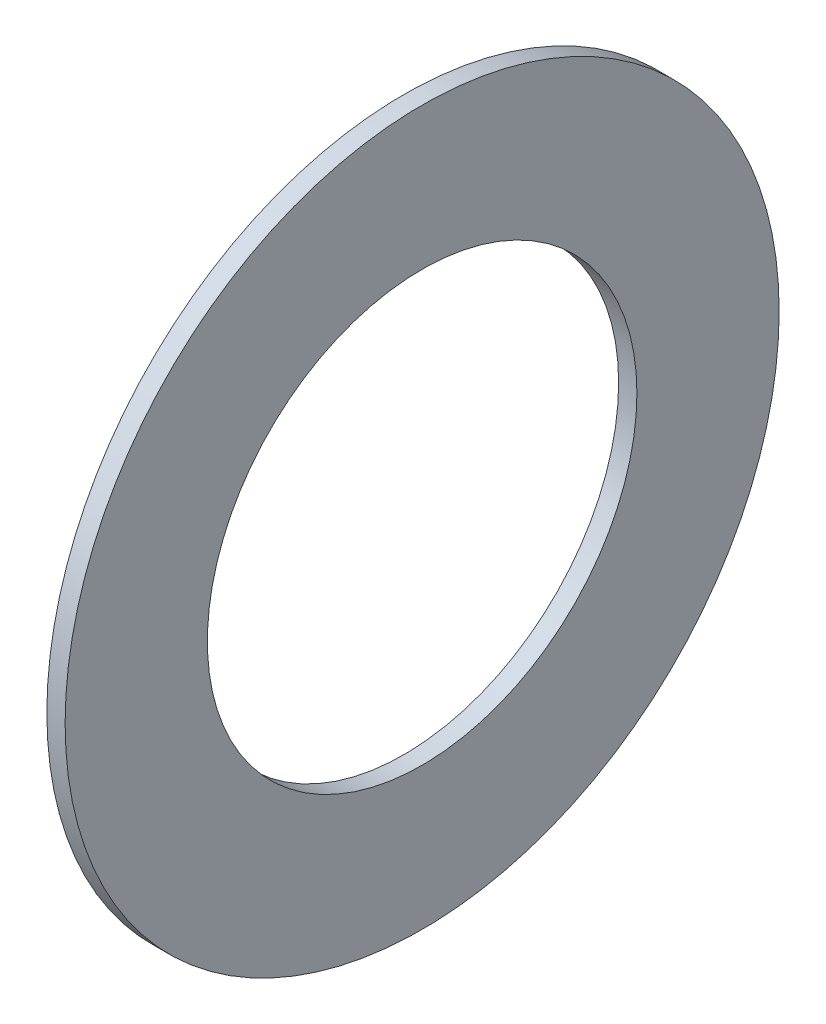
ISO-10303-21;
HEADER;
FILE_DESCRIPTION(('STEP AP214'),'2;1');
FILE_NAME('part.step','',(''),(''),'','','');
FILE_SCHEMA(('AUTOMOTIVE_DESIGN { 1 0 10303 214 1 1 1 1 }'));
ENDSEC;
DATA;
#1=APPLICATION_CONTEXT('core data for automotive mechanical design processes');
#2=APPLICATION_PROTOCOL_DEFINITION('international standard','automotive_design',2000,#1);
#3=PRODUCT_CONTEXT('',#1,'mechanical');
#4=PRODUCT('Part','Part','',(#3));
#5=PRODUCT_RELATED_PRODUCT_CATEGORY('part','',(#4));
#6=PRODUCT_DEFINITION_FORMATION('','',#4);
#7=PRODUCT_DEFINITION_CONTEXT('part definition',#1,'design');
#8=PRODUCT_DEFINITION('design','',#6,#7);
#9=PRODUCT_DEFINITION_SHAPE('','',#8);
#10=(LENGTH_UNIT() NAMED_UNIT(*) SI_UNIT(.MILLI.,.METRE.));
#11=(NAMED_UNIT(*) PLANE_ANGLE_UNIT() SI_UNIT($,.RADIAN.));
#12=(NAMED_UNIT(*) SI_UNIT($,.STERADIAN.) SOLID_ANGLE_UNIT());
#13=UNCERTAINTY_MEASURE_WITH_UNIT(LENGTH_MEASURE(1.E-05),#10,'distance_accuracy_value','');
#14=(GEOMETRIC_REPRESENTATION_CONTEXT(3) GLOBAL_UNCERTAINTY_ASSIGNED_CONTEXT((#13)) GLOBAL_UNIT_ASSIGNED_CONTEXT((#10,
#11,#12)) REPRESENTATION_CONTEXT('',''));
#15=CARTESIAN_POINT('',(0.,0.,0.));
#16=DIRECTION('',(0.,0.,1.));
#17=DIRECTION('',(1.,0.,0.));
#18=AXIS2_PLACEMENT_3D('',#15,#16,#17);
#19=CARTESIAN_POINT('',(0.8128,0.,0.));
#20=DIRECTION('',(1.,0.,0.));
#21=DIRECTION('',(0.,0.,-1.));
#22=AXIS2_PLACEMENT_3D('',#19,#20,#21);
#23=PLANE('',#22);
#24=CARTESIAN_POINT('',(0.8128,0.,0.));
#25=DIRECTION('',(1.,0.,0.));
#26=DIRECTION('',(0.,0.,-1.));
#27=AXIS2_PLACEMENT_3D('',#24,#25,#26);
#28=CIRCLE('',#27,15.875);
#29=CARTESIAN_POINT('',(0.8128,0.,-15.875));
#30=VERTEX_POINT('',#29);
#31=EDGE_CURVE('E10',#30,#30,#28,.T.);
#32=ORIENTED_EDGE('',*,*,#31,.T.);
#33=EDGE_LOOP('',(#32));
#34=FACE_BOUND('',#33,.T.);
#35=CARTESIAN_POINT('',(0.8128,0.,0.));
#36=DIRECTION('',(1.,0.,0.));
#37=DIRECTION('',(0.,0.,-1.));
#38=AXIS2_PLACEMENT_3D('',#35,#36,#37);
#39=CIRCLE('',#38,9.5504);
#40=CARTESIAN_POINT('',(0.8128,0.,-9.5504));
#41=VERTEX_POINT('',#40);
#42=EDGE_CURVE('E45',#41,#41,#39,.T.);
#43=ORIENTED_EDGE('',*,*,#42,.F.);
#44=EDGE_LOOP('',(#43));
#45=FACE_BOUND('',#44,.T.);
#46=ADVANCED_FACE('F34',(#34,#45),#23,.T.);
#47=CARTESIAN_POINT('',(0.,0.,0.));
#48=DIRECTION('',(1.,0.,0.));
#49=DIRECTION('',(0.,0.,-1.));
#50=AXIS2_PLACEMENT_3D('',#47,#48,#49);
#51=PLANE('',#50);
#52=CARTESIAN_POINT('',(0.,0.,0.));
#53=DIRECTION('',(1.,0.,0.));
#54=DIRECTION('',(0.,0.,-1.));
#55=AXIS2_PLACEMENT_3D('',#52,#53,#54);
#56=CIRCLE('',#55,15.875);
#57=CARTESIAN_POINT('',(0.,0.,-15.875));
#58=VERTEX_POINT('',#57);
#59=EDGE_CURVE('E38',#58,#58,#56,.T.);
#60=ORIENTED_EDGE('',*,*,#59,.F.);
#61=EDGE_LOOP('',(#60));
#62=FACE_BOUND('',#61,.T.);
#63=CARTESIAN_POINT('',(0.,0.,0.));
#64=DIRECTION('',(1.,0.,0.));
#65=DIRECTION('',(0.,0.,-1.));
#66=AXIS2_PLACEMENT_3D('',#63,#64,#65);
#67=CIRCLE('',#66,9.5504);
#68=CARTESIAN_POINT('',(0.,0.,-9.5504));
#69=VERTEX_POINT('',#68);
#70=EDGE_CURVE('E47',#69,#69,#67,.T.);
#71=ORIENTED_EDGE('',*,*,#70,.T.);
#72=EDGE_LOOP('',(#71));
#73=FACE_BOUND('',#72,.T.);
#74=ADVANCED_FACE('F57',(#62,#73),#51,.F.);
#75=CARTESIAN_POINT('',(0.8128,0.,0.));
#76=DIRECTION('',(-1.,0.,0.));
#77=DIRECTION('',(0.,0.,1.));
#78=AXIS2_PLACEMENT_3D('',#75,#76,#77);
#79=CYLINDRICAL_SURFACE('',#78,15.875);
#80=ORIENTED_EDGE('',*,*,#31,.F.);
#81=EDGE_LOOP('',(#80));
#82=FACE_BOUND('',#81,.T.);
#83=ORIENTED_EDGE('',*,*,#59,.T.);
#84=EDGE_LOOP('',(#83));
#85=FACE_BOUND('',#84,.T.);
#86=ADVANCED_FACE('F36',(#82,#85),#79,.T.);
#87=CARTESIAN_POINT('',(0.8128,0.,0.));
#88=DIRECTION('',(-1.,0.,0.));
#89=DIRECTION('',(0.,0.,1.));
#90=AXIS2_PLACEMENT_3D('',#87,#88,#89);
#91=CYLINDRICAL_SURFACE('',#90,9.5504);
#92=ORIENTED_EDGE('',*,*,#42,.T.);
#93=EDGE_LOOP('',(#92));
#94=FACE_BOUND('',#93,.T.);
#95=ORIENTED_EDGE('',*,*,#70,.F.);
#96=EDGE_LOOP('',(#95));
#97=FACE_BOUND('',#96,.T.);
#98=ADVANCED_FACE('F53',(#94,#97),#91,.F.);
#99=CLOSED_SHELL('',(#46,#74,#86,#98));
#100=MANIFOLD_SOLID_BREP('B2',#99);
#101=ADVANCED_BREP_SHAPE_REPRESENTATION('',(#18,#100),#14);
#102=SHAPE_DEFINITION_REPRESENTATION(#9,#101);
ENDSEC;
END-ISO-10303-21;
